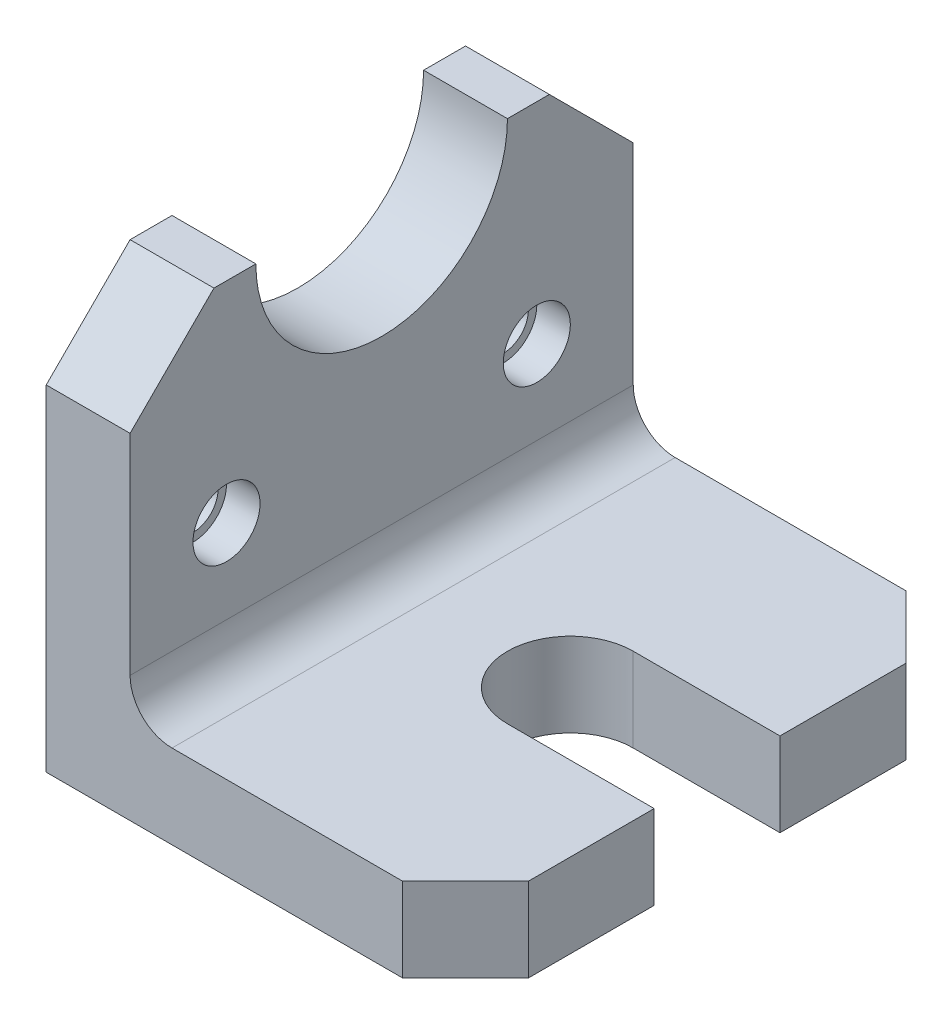
ISO-10303-21;
HEADER;
FILE_DESCRIPTION(('STEP AP214'),'2;1');
FILE_NAME('part.step','',(''),(''),'','','');
FILE_SCHEMA(('AUTOMOTIVE_DESIGN { 1 0 10303 214 1 1 1 1 }'));
ENDSEC;
DATA;
#1=APPLICATION_CONTEXT('core data for automotive mechanical design processes');
#2=APPLICATION_PROTOCOL_DEFINITION('international standard','automotive_design',2000,#1);
#3=PRODUCT_CONTEXT('',#1,'mechanical');
#4=PRODUCT('Part','Part','',(#3));
#5=PRODUCT_RELATED_PRODUCT_CATEGORY('part','',(#4));
#6=PRODUCT_DEFINITION_FORMATION('','',#4);
#7=PRODUCT_DEFINITION_CONTEXT('part definition',#1,'design');
#8=PRODUCT_DEFINITION('design','',#6,#7);
#9=PRODUCT_DEFINITION_SHAPE('','',#8);
#10=(LENGTH_UNIT() NAMED_UNIT(*) SI_UNIT(.MILLI.,.METRE.));
#11=(NAMED_UNIT(*) PLANE_ANGLE_UNIT() SI_UNIT($,.RADIAN.));
#12=(NAMED_UNIT(*) SI_UNIT($,.STERADIAN.) SOLID_ANGLE_UNIT());
#13=UNCERTAINTY_MEASURE_WITH_UNIT(LENGTH_MEASURE(1.E-05),#10,'distance_accuracy_value','');
#14=(GEOMETRIC_REPRESENTATION_CONTEXT(3) GLOBAL_UNCERTAINTY_ASSIGNED_CONTEXT((#13)) GLOBAL_UNIT_ASSIGNED_CONTEXT((#10,
#11,#12)) REPRESENTATION_CONTEXT('',''));
#15=CARTESIAN_POINT('',(0.,0.,0.));
#16=DIRECTION('',(0.,0.,1.));
#17=DIRECTION('',(1.,0.,0.));
#18=AXIS2_PLACEMENT_3D('',#15,#16,#17);
#19=CARTESIAN_POINT('',(100.,0.,60.));
#20=DIRECTION('',(-1.,0.,0.));
#21=DIRECTION('',(0.,0.,1.));
#22=AXIS2_PLACEMENT_3D('',#19,#20,#21);
#23=PLANE('',#22);
#24=DIRECTION('',(0.,-1.,0.));
#25=VECTOR('',#24,1.);
#26=CARTESIAN_POINT('',(100.,296.840462387393,15.));
#27=LINE('',#26,#25);
#28=CARTESIAN_POINT('',(100.,20.,15.));
#29=VERTEX_POINT('',#28);
#30=CARTESIAN_POINT('',(100.,0.,15.));
#31=VERTEX_POINT('',#30);
#32=EDGE_CURVE('E179',#29,#31,#27,.T.);
#33=ORIENTED_EDGE('',*,*,#32,.F.);
#34=DIRECTION('',(0.,0.,-1.));
#35=VECTOR('',#34,1.);
#36=CARTESIAN_POINT('',(100.,20.,60.));
#37=LINE('',#36,#35);
#38=CARTESIAN_POINT('',(100.,20.,44.9999999999999));
#39=VERTEX_POINT('',#38);
#40=EDGE_CURVE('E162',#39,#29,#37,.T.);
#41=ORIENTED_EDGE('',*,*,#40,.F.);
#42=DIRECTION('',(0.,-1.,0.));
#43=VECTOR('',#42,1.);
#44=CARTESIAN_POINT('',(100.,0.,44.9999999999999));
#45=LINE('',#44,#43);
#46=CARTESIAN_POINT('',(100.,0.,44.9999999999999));
#47=VERTEX_POINT('',#46);
#48=EDGE_CURVE('E263',#39,#47,#45,.T.);
#49=ORIENTED_EDGE('',*,*,#48,.T.);
#50=DIRECTION('',(0.,0.,-1.));
#51=VECTOR('',#50,1.);
#52=CARTESIAN_POINT('',(100.,0.,60.));
#53=LINE('',#52,#51);
#54=EDGE_CURVE('E247',#47,#31,#53,.T.);
#55=ORIENTED_EDGE('',*,*,#54,.T.);
#56=EDGE_LOOP('',(#33,#41,#49,#55));
#57=FACE_BOUND('',#56,.T.);
#58=ADVANCED_FACE('F39',(#57),#23,.F.);
#59=CARTESIAN_POINT('',(100.,20.,60.));
#60=DIRECTION('',(0.,-1.,0.));
#61=DIRECTION('',(1.,0.,0.));
#62=AXIS2_PLACEMENT_3D('',#59,#60,#61);
#63=PLANE('',#62);
#64=ORIENTED_EDGE('',*,*,#40,.T.);
#65=DIRECTION('',(-1.,0.,0.));
#66=VECTOR('',#65,1.);
#67=CARTESIAN_POINT('',(65.,20.,15.));
#68=LINE('',#67,#66);
#69=CARTESIAN_POINT('',(65.,20.,15.));
#70=VERTEX_POINT('',#69);
#71=EDGE_CURVE('E156',#29,#70,#68,.T.);
#72=ORIENTED_EDGE('',*,*,#71,.T.);
#73=CARTESIAN_POINT('',(65.,20.,0.));
#74=DIRECTION('',(0.,-1.,0.));
#75=DIRECTION('',(1.,0.,0.));
#76=AXIS2_PLACEMENT_3D('',#73,#74,#75);
#77=CIRCLE('',#76,15.);
#78=CARTESIAN_POINT('',(65.,20.,-15.));
#79=VERTEX_POINT('',#78);
#80=EDGE_CURVE('E159',#70,#79,#77,.T.);
#81=ORIENTED_EDGE('',*,*,#80,.T.);
#82=DIRECTION('',(1.,0.,0.));
#83=VECTOR('',#82,1.);
#84=CARTESIAN_POINT('',(100.,20.,-15.));
#85=LINE('',#84,#83);
#86=CARTESIAN_POINT('',(100.,20.,-15.));
#87=VERTEX_POINT('',#86);
#88=EDGE_CURVE('E174',#79,#87,#85,.T.);
#89=ORIENTED_EDGE('',*,*,#88,.T.);
#90=CARTESIAN_POINT('',(100.,20.,-45.));
#91=VERTEX_POINT('',#90);
#92=EDGE_CURVE('E244',#87,#91,#37,.T.);
#93=ORIENTED_EDGE('',*,*,#92,.T.);
#94=DIRECTION('',(0.70710678118655,0.,0.707106781186546));
#95=VECTOR('',#94,1.);
#96=CARTESIAN_POINT('',(100.,20.,-45.));
#97=LINE('',#96,#95);
#98=CARTESIAN_POINT('',(85.,20.,-60.));
#99=VERTEX_POINT('',#98);
#100=EDGE_CURVE('E256',#91,#99,#97,.F.);
#101=ORIENTED_EDGE('',*,*,#100,.T.);
#102=DIRECTION('',(-1.,0.,0.));
#103=VECTOR('',#102,1.);
#104=CARTESIAN_POINT('',(100.,20.,-60.));
#105=LINE('',#104,#103);
#106=CARTESIAN_POINT('',(30.,20.,-60.));
#107=VERTEX_POINT('',#106);
#108=EDGE_CURVE('E233',#99,#107,#105,.T.);
#109=ORIENTED_EDGE('',*,*,#108,.T.);
#110=DIRECTION('',(0.,0.,-1.));
#111=VECTOR('',#110,1.);
#112=CARTESIAN_POINT('',(30.,20.,60.));
#113=LINE('',#112,#111);
#114=CARTESIAN_POINT('',(30.,20.,60.));
#115=VERTEX_POINT('',#114);
#116=EDGE_CURVE('E296',#107,#115,#113,.F.);
#117=ORIENTED_EDGE('',*,*,#116,.T.);
#118=DIRECTION('',(-1.,0.,0.));
#119=VECTOR('',#118,1.);
#120=CARTESIAN_POINT('',(100.,20.,60.));
#121=LINE('',#120,#119);
#122=CARTESIAN_POINT('',(85.,20.,60.));
#123=VERTEX_POINT('',#122);
#124=EDGE_CURVE('E223',#123,#115,#121,.T.);
#125=ORIENTED_EDGE('',*,*,#124,.F.);
#126=DIRECTION('',(0.707106781186546,0.,-0.70710678118655));
#127=VECTOR('',#126,1.);
#128=CARTESIAN_POINT('',(85.,20.,60.));
#129=LINE('',#128,#127);
#130=EDGE_CURVE('E258',#123,#39,#129,.T.);
#131=ORIENTED_EDGE('',*,*,#130,.T.);
#132=EDGE_LOOP('',(#64,#72,#81,#89,#93,#101,#109,#117,#125,#131));
#133=FACE_BOUND('',#132,.T.);
#134=ADVANCED_FACE('F158',(#133),#63,.F.);
#135=CARTESIAN_POINT('',(-0.001000000000001,50.,37.));
#136=DIRECTION('',(1.,0.,0.));
#137=DIRECTION('',(0.,1.,0.));
#138=AXIS2_PLACEMENT_3D('',#135,#136,#137);
#139=CYLINDRICAL_SURFACE('',#138,6.00000000000001);
#140=CARTESIAN_POINT('',(0.,50.,37.));
#141=DIRECTION('',(1.,0.,0.));
#142=DIRECTION('',(0.,1.,0.));
#143=AXIS2_PLACEMENT_3D('',#140,#141,#142);
#144=CIRCLE('',#143,6.00000000000001);
#145=CARTESIAN_POINT('',(0.,56.,37.));
#146=VERTEX_POINT('',#145);
#147=EDGE_CURVE('E194',#146,#146,#144,.F.);
#148=CARTESIAN_POINT('',(12.,50.,37.));
#149=DIRECTION('',(1.,0.,0.));
#150=DIRECTION('',(0.,1.,0.));
#151=AXIS2_PLACEMENT_3D('',#148,#149,#150);
#152=CIRCLE('',#151,6.00000000000001);
#153=CARTESIAN_POINT('',(12.,56.,37.));
#154=VERTEX_POINT('',#153);
#155=EDGE_CURVE('E182',#154,#154,#152,.T.);
#156=CARTESIAN_POINT('',(0.,56.,37.));
#157=CARTESIAN_POINT('',(0.125000000000001,56.,37.));
#158=CARTESIAN_POINT('',(0.250000000000001,56.,37.));
#159=CARTESIAN_POINT('',(0.500000000000001,56.,37.));
#160=CARTESIAN_POINT('',(0.625000000000001,56.,37.));
#161=CARTESIAN_POINT('',(0.875000000000001,56.,37.));
#162=CARTESIAN_POINT('',(1.,56.,37.));
#163=CARTESIAN_POINT('',(1.25,56.,37.));
#164=CARTESIAN_POINT('',(1.375,56.,37.));
#165=CARTESIAN_POINT('',(1.625,56.,37.));
#166=CARTESIAN_POINT('',(1.75,56.,37.));
#167=CARTESIAN_POINT('',(2.,56.,37.));
#168=CARTESIAN_POINT('',(2.125,56.,37.));
#169=CARTESIAN_POINT('',(2.375,56.,37.));
#170=CARTESIAN_POINT('',(2.5,56.,37.));
#171=CARTESIAN_POINT('',(2.75,56.,37.));
#172=CARTESIAN_POINT('',(2.875,56.,37.));
#173=CARTESIAN_POINT('',(3.125,56.,37.));
#174=CARTESIAN_POINT('',(3.25,56.,37.));
#175=CARTESIAN_POINT('',(3.5,56.,37.));
#176=CARTESIAN_POINT('',(3.625,56.,37.));
#177=CARTESIAN_POINT('',(3.875,56.,37.));
#178=CARTESIAN_POINT('',(4.,56.,37.));
#179=CARTESIAN_POINT('',(4.25,56.,37.));
#180=CARTESIAN_POINT('',(4.375,56.,37.));
#181=CARTESIAN_POINT('',(4.625,56.,37.));
#182=CARTESIAN_POINT('',(4.75,56.,37.));
#183=CARTESIAN_POINT('',(5.,56.,37.));
#184=CARTESIAN_POINT('',(5.125,56.,37.));
#185=CARTESIAN_POINT('',(5.375,56.,37.));
#186=CARTESIAN_POINT('',(5.5,56.,37.));
#187=CARTESIAN_POINT('',(5.75,56.,37.));
#188=CARTESIAN_POINT('',(5.875,56.,37.));
#189=CARTESIAN_POINT('',(6.125,56.,37.));
#190=CARTESIAN_POINT('',(6.25,56.,37.));
#191=CARTESIAN_POINT('',(6.5,56.,37.));
#192=CARTESIAN_POINT('',(6.625,56.,37.));
#193=CARTESIAN_POINT('',(6.875,56.,37.));
#194=CARTESIAN_POINT('',(7.,56.,37.));
#195=CARTESIAN_POINT('',(7.25,56.,37.));
#196=CARTESIAN_POINT('',(7.375,56.,37.));
#197=CARTESIAN_POINT('',(7.625,56.,37.));
#198=CARTESIAN_POINT('',(7.75,56.,37.));
#199=CARTESIAN_POINT('',(8.,56.,37.));
#200=CARTESIAN_POINT('',(8.125,56.,37.));
#201=CARTESIAN_POINT('',(8.375,56.,37.));
#202=CARTESIAN_POINT('',(8.5,56.,37.));
#203=CARTESIAN_POINT('',(8.75,56.,37.));
#204=CARTESIAN_POINT('',(8.875,56.,37.));
#205=CARTESIAN_POINT('',(9.125,56.,37.));
#206=CARTESIAN_POINT('',(9.25,56.,37.));
#207=CARTESIAN_POINT('',(9.5,56.,37.));
#208=CARTESIAN_POINT('',(9.625,56.,37.));
#209=CARTESIAN_POINT('',(9.875,56.,37.));
#210=CARTESIAN_POINT('',(10.,56.,37.));
#211=CARTESIAN_POINT('',(10.25,56.,37.));
#212=CARTESIAN_POINT('',(10.375,56.,37.));
#213=CARTESIAN_POINT('',(10.625,56.,37.));
#214=CARTESIAN_POINT('',(10.75,56.,37.));
#215=CARTESIAN_POINT('',(11.,56.,37.));
#216=CARTESIAN_POINT('',(11.125,56.,37.));
#217=CARTESIAN_POINT('',(11.375,56.,37.));
#218=CARTESIAN_POINT('',(11.5,56.,37.));
#219=CARTESIAN_POINT('',(11.75,56.,37.));
#220=CARTESIAN_POINT('',(11.875,56.,37.));
#221=CARTESIAN_POINT('',(12.,56.,37.));
#222=B_SPLINE_CURVE_WITH_KNOTS('',3,(#156,#157,#158,#159,#160,#161,#162,#163,#164,#165,#166,
#167,#168,#169,#170,#171,#172,#173,#174,#175,#176,#177,#178,#179,#180,#181,#182,#183,#184,#185,
#186,#187,#188,#189,#190,#191,#192,#193,#194,#195,#196,#197,#198,#199,#200,#201,#202,#203,#204,
#205,#206,#207,#208,#209,#210,#211,#212,#213,#214,#215,#216,#217,#218,#219,#220,#221),
.UNSPECIFIED.,.F.,.F.,(4,2,2,2,2,2,2,2,2,2,2,2,2,2,2,2,2,2,2,2,2,2,2,2,2,2,2,2,2,2,2,2,4),(0.,
0.375,0.75,1.125,1.5,1.875,2.25,2.625,3.,3.375,3.75,4.125,4.5,4.875,5.25,5.625,6.,6.375,6.75,
7.125,7.5,7.875,8.25,8.625,9.,9.375,9.75,10.125,10.5,10.875,11.25,11.625,12.),.UNSPECIFIED.);
#223=EDGE_CURVE('BSEAM385',#146,#154,#222,.T.);
#224=ORIENTED_EDGE('',*,*,#147,.T.);
#225=ORIENTED_EDGE('',*,*,#155,.T.);
#226=ORIENTED_EDGE('',*,*,#223,.T.);
#227=ORIENTED_EDGE('',*,*,#223,.F.);
#228=EDGE_LOOP('',(#224,#226,#225,#227));
#229=FACE_BOUND('',#228,.T.);
#230=ADVANCED_FACE('F385',(#229),#139,.F.);
#231=CARTESIAN_POINT('',(-0.001000000000001,50.,-37.));
#232=DIRECTION('',(1.,0.,0.));
#233=DIRECTION('',(0.,1.,0.));
#234=AXIS2_PLACEMENT_3D('',#231,#232,#233);
#235=CYLINDRICAL_SURFACE('',#234,6.00000000000001);
#236=CARTESIAN_POINT('',(0.,50.,-37.));
#237=DIRECTION('',(1.,0.,0.));
#238=DIRECTION('',(0.,1.,0.));
#239=AXIS2_PLACEMENT_3D('',#236,#237,#238);
#240=CIRCLE('',#239,6.00000000000001);
#241=CARTESIAN_POINT('',(0.,56.,-37.));
#242=VERTEX_POINT('',#241);
#243=EDGE_CURVE('E205',#242,#242,#240,.F.);
#244=CARTESIAN_POINT('',(12.,50.,-37.));
#245=DIRECTION('',(1.,0.,0.));
#246=DIRECTION('',(0.,1.,0.));
#247=AXIS2_PLACEMENT_3D('',#244,#245,#246);
#248=CIRCLE('',#247,6.00000000000001);
#249=CARTESIAN_POINT('',(12.,56.,-37.));
#250=VERTEX_POINT('',#249);
#251=EDGE_CURVE('E187',#250,#250,#248,.T.);
#252=CARTESIAN_POINT('',(0.,56.,-37.));
#253=CARTESIAN_POINT('',(0.125000000000001,56.,-37.));
#254=CARTESIAN_POINT('',(0.250000000000001,56.,-37.));
#255=CARTESIAN_POINT('',(0.500000000000001,56.,-37.));
#256=CARTESIAN_POINT('',(0.625000000000001,56.,-37.));
#257=CARTESIAN_POINT('',(0.875000000000001,56.,-37.));
#258=CARTESIAN_POINT('',(1.,56.,-37.));
#259=CARTESIAN_POINT('',(1.25,56.,-37.));
#260=CARTESIAN_POINT('',(1.375,56.,-37.));
#261=CARTESIAN_POINT('',(1.625,56.,-37.));
#262=CARTESIAN_POINT('',(1.75,56.,-37.));
#263=CARTESIAN_POINT('',(2.,56.,-37.));
#264=CARTESIAN_POINT('',(2.125,56.,-37.));
#265=CARTESIAN_POINT('',(2.375,56.,-37.));
#266=CARTESIAN_POINT('',(2.5,56.,-37.));
#267=CARTESIAN_POINT('',(2.75,56.,-37.));
#268=CARTESIAN_POINT('',(2.875,56.,-37.));
#269=CARTESIAN_POINT('',(3.125,56.,-37.));
#270=CARTESIAN_POINT('',(3.25,56.,-37.));
#271=CARTESIAN_POINT('',(3.5,56.,-37.));
#272=CARTESIAN_POINT('',(3.625,56.,-37.));
#273=CARTESIAN_POINT('',(3.875,56.,-37.));
#274=CARTESIAN_POINT('',(4.,56.,-37.));
#275=CARTESIAN_POINT('',(4.25,56.,-37.));
#276=CARTESIAN_POINT('',(4.375,56.,-37.));
#277=CARTESIAN_POINT('',(4.625,56.,-37.));
#278=CARTESIAN_POINT('',(4.75,56.,-37.));
#279=CARTESIAN_POINT('',(5.,56.,-37.));
#280=CARTESIAN_POINT('',(5.125,56.,-37.));
#281=CARTESIAN_POINT('',(5.375,56.,-37.));
#282=CARTESIAN_POINT('',(5.5,56.,-37.));
#283=CARTESIAN_POINT('',(5.75,56.,-37.));
#284=CARTESIAN_POINT('',(5.875,56.,-37.));
#285=CARTESIAN_POINT('',(6.125,56.,-37.));
#286=CARTESIAN_POINT('',(6.25,56.,-37.));
#287=CARTESIAN_POINT('',(6.5,56.,-37.));
#288=CARTESIAN_POINT('',(6.625,56.,-37.));
#289=CARTESIAN_POINT('',(6.875,56.,-37.));
#290=CARTESIAN_POINT('',(7.,56.,-37.));
#291=CARTESIAN_POINT('',(7.25,56.,-37.));
#292=CARTESIAN_POINT('',(7.375,56.,-37.));
#293=CARTESIAN_POINT('',(7.625,56.,-37.));
#294=CARTESIAN_POINT('',(7.75,56.,-37.));
#295=CARTESIAN_POINT('',(8.,56.,-37.));
#296=CARTESIAN_POINT('',(8.125,56.,-37.));
#297=CARTESIAN_POINT('',(8.375,56.,-37.));
#298=CARTESIAN_POINT('',(8.5,56.,-37.));
#299=CARTESIAN_POINT('',(8.75,56.,-37.));
#300=CARTESIAN_POINT('',(8.875,56.,-37.));
#301=CARTESIAN_POINT('',(9.125,56.,-37.));
#302=CARTESIAN_POINT('',(9.25,56.,-37.));
#303=CARTESIAN_POINT('',(9.5,56.,-37.));
#304=CARTESIAN_POINT('',(9.625,56.,-37.));
#305=CARTESIAN_POINT('',(9.875,56.,-37.));
#306=CARTESIAN_POINT('',(10.,56.,-37.));
#307=CARTESIAN_POINT('',(10.25,56.,-37.));
#308=CARTESIAN_POINT('',(10.375,56.,-37.));
#309=CARTESIAN_POINT('',(10.625,56.,-37.));
#310=CARTESIAN_POINT('',(10.75,56.,-37.));
#311=CARTESIAN_POINT('',(11.,56.,-37.));
#312=CARTESIAN_POINT('',(11.125,56.,-37.));
#313=CARTESIAN_POINT('',(11.375,56.,-37.));
#314=CARTESIAN_POINT('',(11.5,56.,-37.));
#315=CARTESIAN_POINT('',(11.75,56.,-37.));
#316=CARTESIAN_POINT('',(11.875,56.,-37.));
#317=CARTESIAN_POINT('',(12.,56.,-37.));
#318=B_SPLINE_CURVE_WITH_KNOTS('',3,(#252,#253,#254,#255,#256,#257,#258,#259,#260,#261,#262,
#263,#264,#265,#266,#267,#268,#269,#270,#271,#272,#273,#274,#275,#276,#277,#278,#279,#280,#281,
#282,#283,#284,#285,#286,#287,#288,#289,#290,#291,#292,#293,#294,#295,#296,#297,#298,#299,#300,
#301,#302,#303,#304,#305,#306,#307,#308,#309,#310,#311,#312,#313,#314,#315,#316,#317),
.UNSPECIFIED.,.F.,.F.,(4,2,2,2,2,2,2,2,2,2,2,2,2,2,2,2,2,2,2,2,2,2,2,2,2,2,2,2,2,2,2,2,4),(0.,
0.375,0.75,1.125,1.5,1.875,2.25,2.625,3.,3.375,3.75,4.125,4.5,4.875,5.25,5.625,6.,6.375,6.75,
7.125,7.5,7.875,8.25,8.625,9.,9.375,9.75,10.125,10.5,10.875,11.25,11.625,12.),.UNSPECIFIED.);
#319=EDGE_CURVE('BSEAM379',#242,#250,#318,.T.);
#320=ORIENTED_EDGE('',*,*,#243,.T.);
#321=ORIENTED_EDGE('',*,*,#251,.T.);
#322=ORIENTED_EDGE('',*,*,#319,.T.);
#323=ORIENTED_EDGE('',*,*,#319,.F.);
#324=EDGE_LOOP('',(#320,#322,#321,#323));
#325=FACE_BOUND('',#324,.T.);
#326=ADVANCED_FACE('F379',(#325),#235,.F.);
#327=CARTESIAN_POINT('',(20.,100.,60.));
#328=DIRECTION('',(0.,-1.,0.));
#329=DIRECTION('',(0.,0.,-1.));
#330=AXIS2_PLACEMENT_3D('',#327,#328,#329);
#331=PLANE('',#330);
#332=DIRECTION('',(0.,0.,-1.));
#333=VECTOR('',#332,1.);
#334=CARTESIAN_POINT('',(0.,100.,60.));
#335=LINE('',#334,#333);
#336=CARTESIAN_POINT('',(0.,100.,-30.));
#337=VERTEX_POINT('',#336);
#338=CARTESIAN_POINT('',(0.,100.,-40.));
#339=VERTEX_POINT('',#338);
#340=EDGE_CURVE('E228',#337,#339,#335,.T.);
#341=ORIENTED_EDGE('',*,*,#340,.F.);
#342=DIRECTION('',(1.,0.,0.));
#343=VECTOR('',#342,1.);
#344=CARTESIAN_POINT('',(-0.00100000000000447,100.,-30.));
#345=LINE('',#344,#343);
#346=CARTESIAN_POINT('',(20.,100.,-30.));
#347=VERTEX_POINT('',#346);
#348=EDGE_CURVE('E206',#337,#347,#345,.T.);
#349=ORIENTED_EDGE('',*,*,#348,.T.);
#350=DIRECTION('',(0.,0.,-1.));
#351=VECTOR('',#350,1.);
#352=CARTESIAN_POINT('',(20.,100.,60.));
#353=LINE('',#352,#351);
#354=CARTESIAN_POINT('',(20.,100.,-40.));
#355=VERTEX_POINT('',#354);
#356=EDGE_CURVE('E240',#347,#355,#353,.T.);
#357=ORIENTED_EDGE('',*,*,#356,.T.);
#358=DIRECTION('',(-1.,0.,0.));
#359=VECTOR('',#358,1.);
#360=CARTESIAN_POINT('',(20.,100.,-40.));
#361=LINE('',#360,#359);
#362=EDGE_CURVE('E279',#355,#339,#361,.T.);
#363=ORIENTED_EDGE('',*,*,#362,.T.);
#364=EDGE_LOOP('',(#341,#349,#357,#363));
#365=FACE_BOUND('',#364,.T.);
#366=ADVANCED_FACE('F361',(#365),#331,.F.);
#367=CARTESIAN_POINT('',(0.,100.,60.));
#368=DIRECTION('',(1.,0.,0.));
#369=DIRECTION('',(0.,1.,0.));
#370=AXIS2_PLACEMENT_3D('',#367,#368,#369);
#371=PLANE('',#370);
#372=ORIENTED_EDGE('',*,*,#243,.F.);
#373=EDGE_LOOP('',(#372));
#374=FACE_BOUND('',#373,.T.);
#375=ORIENTED_EDGE('',*,*,#147,.F.);
#376=EDGE_LOOP('',(#375));
#377=FACE_BOUND('',#376,.T.);
#378=CARTESIAN_POINT('',(0.,100.,40.));
#379=VERTEX_POINT('',#378);
#380=CARTESIAN_POINT('',(0.,100.,30.));
#381=VERTEX_POINT('',#380);
#382=EDGE_CURVE('E237',#379,#381,#335,.T.);
#383=ORIENTED_EDGE('',*,*,#382,.T.);
#384=CARTESIAN_POINT('',(0.,100.,0.));
#385=DIRECTION('',(1.,0.,0.));
#386=DIRECTION('',(0.,1.,0.));
#387=AXIS2_PLACEMENT_3D('',#384,#385,#386);
#388=CIRCLE('',#387,30.);
#389=EDGE_CURVE('E209',#337,#381,#388,.F.);
#390=ORIENTED_EDGE('',*,*,#389,.F.);
#391=ORIENTED_EDGE('',*,*,#340,.T.);
#392=DIRECTION('',(0.,0.707106781186549,0.707106781186547));
#393=VECTOR('',#392,1.);
#394=CARTESIAN_POINT('',(0.,100.,-40.));
#395=LINE('',#394,#393);
#396=CARTESIAN_POINT('',(0.,79.9999999999999,-60.));
#397=VERTEX_POINT('',#396);
#398=EDGE_CURVE('E275',#339,#397,#395,.F.);
#399=ORIENTED_EDGE('',*,*,#398,.T.);
#400=DIRECTION('',(0.,-1.,0.));
#401=VECTOR('',#400,1.);
#402=CARTESIAN_POINT('',(0.,100.,-60.));
#403=LINE('',#402,#401);
#404=CARTESIAN_POINT('',(0.,0.,-60.));
#405=VERTEX_POINT('',#404);
#406=EDGE_CURVE('E212',#397,#405,#403,.T.);
#407=ORIENTED_EDGE('',*,*,#406,.T.);
#408=DIRECTION('',(0.,0.,-1.));
#409=VECTOR('',#408,1.);
#410=CARTESIAN_POINT('',(0.,0.,60.));
#411=LINE('',#410,#409);
#412=CARTESIAN_POINT('',(0.,0.,60.));
#413=VERTEX_POINT('',#412);
#414=EDGE_CURVE('E250',#413,#405,#411,.T.);
#415=ORIENTED_EDGE('',*,*,#414,.F.);
#416=DIRECTION('',(0.,-1.,0.));
#417=VECTOR('',#416,1.);
#418=CARTESIAN_POINT('',(0.,100.,60.));
#419=LINE('',#418,#417);
#420=CARTESIAN_POINT('',(0.,80.,60.));
#421=VERTEX_POINT('',#420);
#422=EDGE_CURVE('E217',#421,#413,#419,.T.);
#423=ORIENTED_EDGE('',*,*,#422,.F.);
#424=DIRECTION('',(0.,0.707106781186547,-0.707106781186549));
#425=VECTOR('',#424,1.);
#426=CARTESIAN_POINT('',(0.,80.,60.));
#427=LINE('',#426,#425);
#428=EDGE_CURVE('E277',#421,#379,#427,.T.);
#429=ORIENTED_EDGE('',*,*,#428,.T.);
#430=EDGE_LOOP('',(#383,#390,#391,#399,#407,#415,#423,#429));
#431=FACE_BOUND('',#430,.T.);
#432=ADVANCED_FACE('F326',(#374,#377,#431),#371,.F.);
#433=CARTESIAN_POINT('',(0.,0.,60.));
#434=DIRECTION('',(0.,1.,0.));
#435=DIRECTION('',(0.,0.,1.));
#436=AXIS2_PLACEMENT_3D('',#433,#434,#435);
#437=PLANE('',#436);
#438=DIRECTION('',(1.,0.,0.));
#439=VECTOR('',#438,1.);
#440=CARTESIAN_POINT('',(100.,0.,-15.));
#441=LINE('',#440,#439);
#442=CARTESIAN_POINT('',(65.,0.,-15.));
#443=VERTEX_POINT('',#442);
#444=CARTESIAN_POINT('',(100.,0.,-15.));
#445=VERTEX_POINT('',#444);
#446=EDGE_CURVE('E54',#443,#445,#441,.T.);
#447=ORIENTED_EDGE('',*,*,#446,.F.);
#448=CARTESIAN_POINT('',(65.,0.,0.));
#449=DIRECTION('',(0.,-1.,0.));
#450=DIRECTION('',(1.,0.,0.));
#451=AXIS2_PLACEMENT_3D('',#448,#449,#450);
#452=CIRCLE('',#451,15.);
#453=CARTESIAN_POINT('',(65.,0.,15.));
#454=VERTEX_POINT('',#453);
#455=EDGE_CURVE('E58',#454,#443,#452,.T.);
#456=ORIENTED_EDGE('',*,*,#455,.F.);
#457=DIRECTION('',(-1.,0.,0.));
#458=VECTOR('',#457,1.);
#459=CARTESIAN_POINT('',(65.,0.,15.));
#460=LINE('',#459,#458);
#461=EDGE_CURVE('E177',#31,#454,#460,.T.);
#462=ORIENTED_EDGE('',*,*,#461,.F.);
#463=ORIENTED_EDGE('',*,*,#54,.F.);
#464=DIRECTION('',(-0.707106781186546,0.,0.70710678118655));
#465=VECTOR('',#464,1.);
#466=CARTESIAN_POINT('',(85.,0.,60.));
#467=LINE('',#466,#465);
#468=CARTESIAN_POINT('',(85.,0.,60.));
#469=VERTEX_POINT('',#468);
#470=EDGE_CURVE('E268',#47,#469,#467,.T.);
#471=ORIENTED_EDGE('',*,*,#470,.T.);
#472=DIRECTION('',(1.,0.,0.));
#473=VECTOR('',#472,1.);
#474=CARTESIAN_POINT('',(0.,0.,60.));
#475=LINE('',#474,#473);
#476=EDGE_CURVE('E219',#413,#469,#475,.T.);
#477=ORIENTED_EDGE('',*,*,#476,.F.);
#478=ORIENTED_EDGE('',*,*,#414,.T.);
#479=DIRECTION('',(1.,0.,0.));
#480=VECTOR('',#479,1.);
#481=CARTESIAN_POINT('',(0.,0.,-60.));
#482=LINE('',#481,#480);
#483=CARTESIAN_POINT('',(85.,0.,-60.));
#484=VERTEX_POINT('',#483);
#485=EDGE_CURVE('E230',#405,#484,#482,.T.);
#486=ORIENTED_EDGE('',*,*,#485,.T.);
#487=DIRECTION('',(-0.70710678118655,0.,-0.707106781186546));
#488=VECTOR('',#487,1.);
#489=CARTESIAN_POINT('',(100.,0.,-45.));
#490=LINE('',#489,#488);
#491=CARTESIAN_POINT('',(100.,0.,-45.));
#492=VERTEX_POINT('',#491);
#493=EDGE_CURVE('E265',#484,#492,#490,.F.);
#494=ORIENTED_EDGE('',*,*,#493,.T.);
#495=EDGE_CURVE('E246',#445,#492,#53,.T.);
#496=ORIENTED_EDGE('',*,*,#495,.F.);
#497=EDGE_LOOP('',(#447,#456,#462,#463,#471,#477,#478,#486,#494,#496));
#498=FACE_BOUND('',#497,.T.);
#499=ADVANCED_FACE('F329',(#498),#437,.F.);
#500=ORIENTED_EDGE('',*,*,#92,.F.);
#501=DIRECTION('',(0.,-1.,0.));
#502=VECTOR('',#501,1.);
#503=CARTESIAN_POINT('',(100.,296.840462387393,-15.));
#504=LINE('',#503,#502);
#505=EDGE_CURVE('E338',#87,#445,#504,.T.);
#506=ORIENTED_EDGE('',*,*,#505,.T.);
#507=ORIENTED_EDGE('',*,*,#495,.T.);
#508=DIRECTION('',(0.,1.,0.));
#509=VECTOR('',#508,1.);
#510=CARTESIAN_POINT('',(100.,0.,-45.));
#511=LINE('',#510,#509);
#512=EDGE_CURVE('E260',#492,#91,#511,.T.);
#513=ORIENTED_EDGE('',*,*,#512,.T.);
#514=EDGE_LOOP('',(#500,#506,#507,#513));
#515=FACE_BOUND('',#514,.T.);
#516=ADVANCED_FACE('F349',(#515),#23,.F.);
#517=CARTESIAN_POINT('',(20.,20.,60.));
#518=DIRECTION('',(-1.,0.,0.));
#519=DIRECTION('',(0.,-1.,0.));
#520=AXIS2_PLACEMENT_3D('',#517,#518,#519);
#521=PLANE('',#520);
#522=CARTESIAN_POINT('',(20.,50.,-37.));
#523=DIRECTION('',(1.,0.,0.));
#524=DIRECTION('',(0.,1.,0.));
#525=AXIS2_PLACEMENT_3D('',#522,#523,#524);
#526=CIRCLE('',#525,8.);
#527=CARTESIAN_POINT('',(20.,58.,-37.));
#528=VERTEX_POINT('',#527);
#529=EDGE_CURVE('E191',#528,#528,#526,.T.);
#530=ORIENTED_EDGE('',*,*,#529,.F.);
#531=EDGE_LOOP('',(#530));
#532=FACE_BOUND('',#531,.T.);
#533=CARTESIAN_POINT('',(20.,50.,37.));
#534=DIRECTION('',(1.,0.,0.));
#535=DIRECTION('',(0.,1.,0.));
#536=AXIS2_PLACEMENT_3D('',#533,#534,#535);
#537=CIRCLE('',#536,8.00000000000001);
#538=CARTESIAN_POINT('',(20.,58.,37.));
#539=VERTEX_POINT('',#538);
#540=EDGE_CURVE('E178',#539,#539,#537,.T.);
#541=ORIENTED_EDGE('',*,*,#540,.F.);
#542=EDGE_LOOP('',(#541));
#543=FACE_BOUND('',#542,.T.);
#544=ORIENTED_EDGE('',*,*,#356,.F.);
#545=CARTESIAN_POINT('',(20.,100.,0.));
#546=DIRECTION('',(1.,0.,0.));
#547=DIRECTION('',(0.,1.,0.));
#548=AXIS2_PLACEMENT_3D('',#545,#546,#547);
#549=CIRCLE('',#548,30.);
#550=CARTESIAN_POINT('',(20.,100.,30.));
#551=VERTEX_POINT('',#550);
#552=EDGE_CURVE('E202',#551,#347,#549,.T.);
#553=ORIENTED_EDGE('',*,*,#552,.F.);
#554=CARTESIAN_POINT('',(20.,100.,40.));
#555=VERTEX_POINT('',#554);
#556=EDGE_CURVE('E241',#555,#551,#353,.T.);
#557=ORIENTED_EDGE('',*,*,#556,.F.);
#558=DIRECTION('',(0.,-0.707106781186547,0.707106781186549));
#559=VECTOR('',#558,1.);
#560=CARTESIAN_POINT('',(20.,80.,60.));
#561=LINE('',#560,#559);
#562=CARTESIAN_POINT('',(20.,80.,60.));
#563=VERTEX_POINT('',#562);
#564=EDGE_CURVE('E287',#555,#563,#561,.T.);
#565=ORIENTED_EDGE('',*,*,#564,.T.);
#566=DIRECTION('',(0.,1.,0.));
#567=VECTOR('',#566,1.);
#568=CARTESIAN_POINT('',(20.,20.,60.));
#569=LINE('',#568,#567);
#570=CARTESIAN_POINT('',(20.,30.,60.));
#571=VERTEX_POINT('',#570);
#572=EDGE_CURVE('E226',#571,#563,#569,.T.);
#573=ORIENTED_EDGE('',*,*,#572,.F.);
#574=DIRECTION('',(0.,0.,-1.));
#575=VECTOR('',#574,1.);
#576=CARTESIAN_POINT('',(20.,30.,-60.));
#577=LINE('',#576,#575);
#578=CARTESIAN_POINT('',(20.,30.,-60.));
#579=VERTEX_POINT('',#578);
#580=EDGE_CURVE('E293',#571,#579,#577,.T.);
#581=ORIENTED_EDGE('',*,*,#580,.T.);
#582=DIRECTION('',(0.,1.,0.));
#583=VECTOR('',#582,1.);
#584=CARTESIAN_POINT('',(20.,20.,-60.));
#585=LINE('',#584,#583);
#586=CARTESIAN_POINT('',(20.,79.9999999999999,-60.));
#587=VERTEX_POINT('',#586);
#588=EDGE_CURVE('E220',#579,#587,#585,.T.);
#589=ORIENTED_EDGE('',*,*,#588,.T.);
#590=DIRECTION('',(0.,-0.707106781186549,-0.707106781186547));
#591=VECTOR('',#590,1.);
#592=CARTESIAN_POINT('',(20.,100.,-40.));
#593=LINE('',#592,#591);
#594=EDGE_CURVE('E284',#587,#355,#593,.F.);
#595=ORIENTED_EDGE('',*,*,#594,.T.);
#596=EDGE_LOOP('',(#544,#553,#557,#565,#573,#581,#589,#595));
#597=FACE_BOUND('',#596,.T.);
#598=ADVANCED_FACE('F314',(#532,#543,#597),#521,.F.);
#599=ORIENTED_EDGE('',*,*,#556,.T.);
#600=DIRECTION('',(1.,0.,0.));
#601=VECTOR('',#600,1.);
#602=CARTESIAN_POINT('',(-0.00100000000000447,100.,30.));
#603=LINE('',#602,#601);
#604=EDGE_CURVE('E204',#381,#551,#603,.T.);
#605=ORIENTED_EDGE('',*,*,#604,.F.);
#606=ORIENTED_EDGE('',*,*,#382,.F.);
#607=DIRECTION('',(1.,0.,0.));
#608=VECTOR('',#607,1.);
#609=CARTESIAN_POINT('',(20.,100.,40.));
#610=LINE('',#609,#608);
#611=EDGE_CURVE('E282',#379,#555,#610,.T.);
#612=ORIENTED_EDGE('',*,*,#611,.T.);
#613=EDGE_LOOP('',(#599,#605,#606,#612));
#614=FACE_BOUND('',#613,.T.);
#615=ADVANCED_FACE('F367',(#614),#331,.F.);
#616=CARTESIAN_POINT('',(0.,0.,60.));
#617=DIRECTION('',(0.,0.,1.));
#618=DIRECTION('',(1.,0.,0.));
#619=AXIS2_PLACEMENT_3D('',#616,#617,#618);
#620=PLANE('',#619);
#621=ORIENTED_EDGE('',*,*,#124,.T.);
#622=CARTESIAN_POINT('',(30.,30.,60.));
#623=DIRECTION('',(0.,0.,1.));
#624=DIRECTION('',(1.,0.,0.));
#625=AXIS2_PLACEMENT_3D('',#622,#623,#624);
#626=CIRCLE('',#625,10.);
#627=EDGE_CURVE('E11',#115,#571,#626,.F.);
#628=ORIENTED_EDGE('',*,*,#627,.T.);
#629=ORIENTED_EDGE('',*,*,#572,.T.);
#630=DIRECTION('',(-1.,0.,0.));
#631=VECTOR('',#630,1.);
#632=CARTESIAN_POINT('',(0.,80.,60.));
#633=LINE('',#632,#631);
#634=EDGE_CURVE('E272',#563,#421,#633,.T.);
#635=ORIENTED_EDGE('',*,*,#634,.T.);
#636=ORIENTED_EDGE('',*,*,#422,.T.);
#637=ORIENTED_EDGE('',*,*,#476,.T.);
#638=DIRECTION('',(0.,1.,0.));
#639=VECTOR('',#638,1.);
#640=CARTESIAN_POINT('',(85.,20.,60.));
#641=LINE('',#640,#639);
#642=EDGE_CURVE('E253',#469,#123,#641,.T.);
#643=ORIENTED_EDGE('',*,*,#642,.T.);
#644=EDGE_LOOP('',(#621,#628,#629,#635,#636,#637,#643));
#645=FACE_BOUND('',#644,.T.);
#646=ADVANCED_FACE('F311',(#645),#620,.T.);
#647=CARTESIAN_POINT('',(0.,0.,-60.));
#648=DIRECTION('',(0.,0.,1.));
#649=DIRECTION('',(1.,0.,0.));
#650=AXIS2_PLACEMENT_3D('',#647,#648,#649);
#651=PLANE('',#650);
#652=ORIENTED_EDGE('',*,*,#406,.F.);
#653=DIRECTION('',(1.,0.,0.));
#654=VECTOR('',#653,1.);
#655=CARTESIAN_POINT('',(0.,79.9999999999999,-60.));
#656=LINE('',#655,#654);
#657=EDGE_CURVE('E290',#397,#587,#656,.T.);
#658=ORIENTED_EDGE('',*,*,#657,.T.);
#659=ORIENTED_EDGE('',*,*,#588,.F.);
#660=CARTESIAN_POINT('',(30.,30.,-60.));
#661=DIRECTION('',(0.,0.,1.));
#662=DIRECTION('',(1.,0.,0.));
#663=AXIS2_PLACEMENT_3D('',#660,#661,#662);
#664=CIRCLE('',#663,10.);
#665=EDGE_CURVE('E47',#579,#107,#664,.T.);
#666=ORIENTED_EDGE('',*,*,#665,.T.);
#667=ORIENTED_EDGE('',*,*,#108,.F.);
#668=DIRECTION('',(0.,-1.,0.));
#669=VECTOR('',#668,1.);
#670=CARTESIAN_POINT('',(85.,0.,-60.));
#671=LINE('',#670,#669);
#672=EDGE_CURVE('E270',#99,#484,#671,.T.);
#673=ORIENTED_EDGE('',*,*,#672,.T.);
#674=ORIENTED_EDGE('',*,*,#485,.F.);
#675=EDGE_LOOP('',(#652,#658,#659,#666,#667,#673,#674));
#676=FACE_BOUND('',#675,.T.);
#677=ADVANCED_FACE('F301',(#676),#651,.F.);
#678=CARTESIAN_POINT('',(85.,0.,60.));
#679=DIRECTION('',(0.70710678118655,0.,0.707106781186546));
#680=DIRECTION('',(0.,-1.,0.));
#681=AXIS2_PLACEMENT_3D('',#678,#679,#680);
#682=PLANE('',#681);
#683=ORIENTED_EDGE('',*,*,#470,.F.);
#684=ORIENTED_EDGE('',*,*,#48,.F.);
#685=ORIENTED_EDGE('',*,*,#130,.F.);
#686=ORIENTED_EDGE('',*,*,#642,.F.);
#687=EDGE_LOOP('',(#683,#684,#685,#686));
#688=FACE_BOUND('',#687,.T.);
#689=ADVANCED_FACE('F335',(#688),#682,.T.);
#690=CARTESIAN_POINT('',(100.,0.,-45.));
#691=DIRECTION('',(-0.707106781186545,0.,0.707106781186549));
#692=DIRECTION('',(0.,1.,0.));
#693=AXIS2_PLACEMENT_3D('',#690,#691,#692);
#694=PLANE('',#693);
#695=ORIENTED_EDGE('',*,*,#493,.F.);
#696=ORIENTED_EDGE('',*,*,#672,.F.);
#697=ORIENTED_EDGE('',*,*,#100,.F.);
#698=ORIENTED_EDGE('',*,*,#512,.F.);
#699=EDGE_LOOP('',(#695,#696,#697,#698));
#700=FACE_BOUND('',#699,.T.);
#701=ADVANCED_FACE('F352',(#700),#694,.F.);
#702=CARTESIAN_POINT('',(0.,80.,60.));
#703=DIRECTION('',(0.,0.707106781186548,0.707106781186546));
#704=DIRECTION('',(1.,0.,0.));
#705=AXIS2_PLACEMENT_3D('',#702,#703,#704);
#706=PLANE('',#705);
#707=ORIENTED_EDGE('',*,*,#564,.F.);
#708=ORIENTED_EDGE('',*,*,#611,.F.);
#709=ORIENTED_EDGE('',*,*,#428,.F.);
#710=ORIENTED_EDGE('',*,*,#634,.F.);
#711=EDGE_LOOP('',(#707,#708,#709,#710));
#712=FACE_BOUND('',#711,.T.);
#713=ADVANCED_FACE('F321',(#712),#706,.T.);
#714=CARTESIAN_POINT('',(20.,100.,-40.));
#715=DIRECTION('',(0.,-0.707106781186547,0.707106781186549));
#716=DIRECTION('',(-1.,0.,0.));
#717=AXIS2_PLACEMENT_3D('',#714,#715,#716);
#718=PLANE('',#717);
#719=ORIENTED_EDGE('',*,*,#594,.F.);
#720=ORIENTED_EDGE('',*,*,#657,.F.);
#721=ORIENTED_EDGE('',*,*,#398,.F.);
#722=ORIENTED_EDGE('',*,*,#362,.F.);
#723=EDGE_LOOP('',(#719,#720,#721,#722));
#724=FACE_BOUND('',#723,.T.);
#725=ADVANCED_FACE('F357',(#724),#718,.F.);
#726=CARTESIAN_POINT('',(30.,30.,60.));
#727=DIRECTION('',(0.,0.,1.));
#728=DIRECTION('',(1.,0.,0.));
#729=AXIS2_PLACEMENT_3D('',#726,#727,#728);
#730=CYLINDRICAL_SURFACE('',#729,10.);
#731=ORIENTED_EDGE('',*,*,#627,.F.);
#732=ORIENTED_EDGE('',*,*,#116,.F.);
#733=ORIENTED_EDGE('',*,*,#665,.F.);
#734=ORIENTED_EDGE('',*,*,#580,.F.);
#735=EDGE_LOOP('',(#731,#732,#733,#734));
#736=FACE_BOUND('',#735,.T.);
#737=ADVANCED_FACE('F41',(#736),#730,.F.);
#738=CARTESIAN_POINT('',(-0.00100000000000447,100.,0.));
#739=DIRECTION('',(1.,0.,0.));
#740=DIRECTION('',(0.,1.,0.));
#741=AXIS2_PLACEMENT_3D('',#738,#739,#740);
#742=CYLINDRICAL_SURFACE('',#741,30.);
#743=ORIENTED_EDGE('',*,*,#389,.T.);
#744=ORIENTED_EDGE('',*,*,#604,.T.);
#745=ORIENTED_EDGE('',*,*,#552,.T.);
#746=ORIENTED_EDGE('',*,*,#348,.F.);
#747=EDGE_LOOP('',(#743,#744,#745,#746));
#748=FACE_BOUND('',#747,.T.);
#749=ADVANCED_FACE('F364',(#748),#742,.F.);
#750=CARTESIAN_POINT('',(12.,50.,-37.));
#751=DIRECTION('',(1.,0.,0.));
#752=DIRECTION('',(0.,1.,0.));
#753=AXIS2_PLACEMENT_3D('',#750,#751,#752);
#754=CYLINDRICAL_SURFACE('',#753,8.);
#755=CARTESIAN_POINT('',(12.,50.,-37.));
#756=DIRECTION('',(1.,0.,0.));
#757=DIRECTION('',(0.,1.,0.));
#758=AXIS2_PLACEMENT_3D('',#755,#756,#757);
#759=CIRCLE('',#758,8.);
#760=CARTESIAN_POINT('',(12.,58.,-37.));
#761=VERTEX_POINT('',#760);
#762=EDGE_CURVE('E190',#761,#761,#759,.T.);
#763=ORIENTED_EDGE('',*,*,#762,.F.);
#764=EDGE_LOOP('',(#763));
#765=FACE_BOUND('',#764,.T.);
#766=ORIENTED_EDGE('',*,*,#529,.T.);
#767=EDGE_LOOP('',(#766));
#768=FACE_BOUND('',#767,.T.);
#769=ADVANCED_FACE('F422',(#765,#768),#754,.F.);
#770=CARTESIAN_POINT('',(12.,0.,0.));
#771=DIRECTION('',(1.,0.,0.));
#772=DIRECTION('',(0.,1.,0.));
#773=AXIS2_PLACEMENT_3D('',#770,#771,#772);
#774=PLANE('',#773);
#775=ORIENTED_EDGE('',*,*,#251,.F.);
#776=EDGE_LOOP('',(#775));
#777=FACE_BOUND('',#776,.T.);
#778=ORIENTED_EDGE('',*,*,#762,.T.);
#779=EDGE_LOOP('',(#778));
#780=FACE_BOUND('',#779,.T.);
#781=ADVANCED_FACE('F427',(#777,#780),#774,.T.);
#782=CARTESIAN_POINT('',(12.,50.,37.));
#783=DIRECTION('',(1.,0.,0.));
#784=DIRECTION('',(0.,1.,0.));
#785=AXIS2_PLACEMENT_3D('',#782,#783,#784);
#786=CYLINDRICAL_SURFACE('',#785,8.00000000000001);
#787=CARTESIAN_POINT('',(12.,50.,37.));
#788=DIRECTION('',(1.,0.,0.));
#789=DIRECTION('',(0.,1.,0.));
#790=AXIS2_PLACEMENT_3D('',#787,#788,#789);
#791=CIRCLE('',#790,8.00000000000001);
#792=CARTESIAN_POINT('',(12.,58.,37.));
#793=VERTEX_POINT('',#792);
#794=EDGE_CURVE('E197',#793,#793,#791,.T.);
#795=ORIENTED_EDGE('',*,*,#794,.F.);
#796=EDGE_LOOP('',(#795));
#797=FACE_BOUND('',#796,.T.);
#798=ORIENTED_EDGE('',*,*,#540,.T.);
#799=EDGE_LOOP('',(#798));
#800=FACE_BOUND('',#799,.T.);
#801=ADVANCED_FACE('F432',(#797,#800),#786,.F.);
#802=CARTESIAN_POINT('',(12.,0.,0.));
#803=DIRECTION('',(1.,0.,0.));
#804=DIRECTION('',(0.,1.,0.));
#805=AXIS2_PLACEMENT_3D('',#802,#803,#804);
#806=PLANE('',#805);
#807=ORIENTED_EDGE('',*,*,#155,.F.);
#808=EDGE_LOOP('',(#807));
#809=FACE_BOUND('',#808,.T.);
#810=ORIENTED_EDGE('',*,*,#794,.T.);
#811=EDGE_LOOP('',(#810));
#812=FACE_BOUND('',#811,.T.);
#813=ADVANCED_FACE('F544',(#809,#812),#806,.T.);
#814=CARTESIAN_POINT('',(65.,296.840462387393,15.));
#815=DIRECTION('',(0.,0.,-1.));
#816=DIRECTION('',(-1.,0.,0.));
#817=AXIS2_PLACEMENT_3D('',#814,#815,#816);
#818=PLANE('',#817);
#819=ORIENTED_EDGE('',*,*,#71,.F.);
#820=ORIENTED_EDGE('',*,*,#32,.T.);
#821=ORIENTED_EDGE('',*,*,#461,.T.);
#822=DIRECTION('',(0.,-1.,0.));
#823=VECTOR('',#822,1.);
#824=CARTESIAN_POINT('',(65.,296.840462387393,15.));
#825=LINE('',#824,#823);
#826=EDGE_CURVE('E171',#70,#454,#825,.T.);
#827=ORIENTED_EDGE('',*,*,#826,.F.);
#828=EDGE_LOOP('',(#819,#820,#821,#827));
#829=FACE_BOUND('',#828,.T.);
#830=ADVANCED_FACE('F176',(#829),#818,.T.);
#831=CARTESIAN_POINT('',(65.,296.840462387393,0.));
#832=DIRECTION('',(0.,-1.,0.));
#833=DIRECTION('',(1.,0.,0.));
#834=AXIS2_PLACEMENT_3D('',#831,#832,#833);
#835=CYLINDRICAL_SURFACE('',#834,15.);
#836=ORIENTED_EDGE('',*,*,#80,.F.);
#837=ORIENTED_EDGE('',*,*,#826,.T.);
#838=ORIENTED_EDGE('',*,*,#455,.T.);
#839=DIRECTION('',(0.,-1.,0.));
#840=VECTOR('',#839,1.);
#841=CARTESIAN_POINT('',(65.,296.840462387393,-15.));
#842=LINE('',#841,#840);
#843=EDGE_CURVE('E173',#79,#443,#842,.T.);
#844=ORIENTED_EDGE('',*,*,#843,.F.);
#845=EDGE_LOOP('',(#836,#837,#838,#844));
#846=FACE_BOUND('',#845,.T.);
#847=ADVANCED_FACE('F170',(#846),#835,.F.);
#848=CARTESIAN_POINT('',(100.,296.840462387393,-15.));
#849=DIRECTION('',(0.,0.,1.));
#850=DIRECTION('',(1.,0.,0.));
#851=AXIS2_PLACEMENT_3D('',#848,#849,#850);
#852=PLANE('',#851);
#853=ORIENTED_EDGE('',*,*,#88,.F.);
#854=ORIENTED_EDGE('',*,*,#843,.T.);
#855=ORIENTED_EDGE('',*,*,#446,.T.);
#856=ORIENTED_EDGE('',*,*,#505,.F.);
#857=EDGE_LOOP('',(#853,#854,#855,#856));
#858=FACE_BOUND('',#857,.T.);
#859=ADVANCED_FACE('F345',(#858),#852,.T.);
#860=CLOSED_SHELL('',(#58,#134,#230,#326,#366,#432,#499,#516,#598,#615,#646,#677,#689,#701,#713,
#725,#737,#749,#769,#781,#801,#813,#830,#847,#859));
#861=MANIFOLD_SOLID_BREP('B2',#860);
#862=ADVANCED_BREP_SHAPE_REPRESENTATION('',(#18,#861),#14);
#863=SHAPE_DEFINITION_REPRESENTATION(#9,#862);
ENDSEC;
END-ISO-10303-21;
